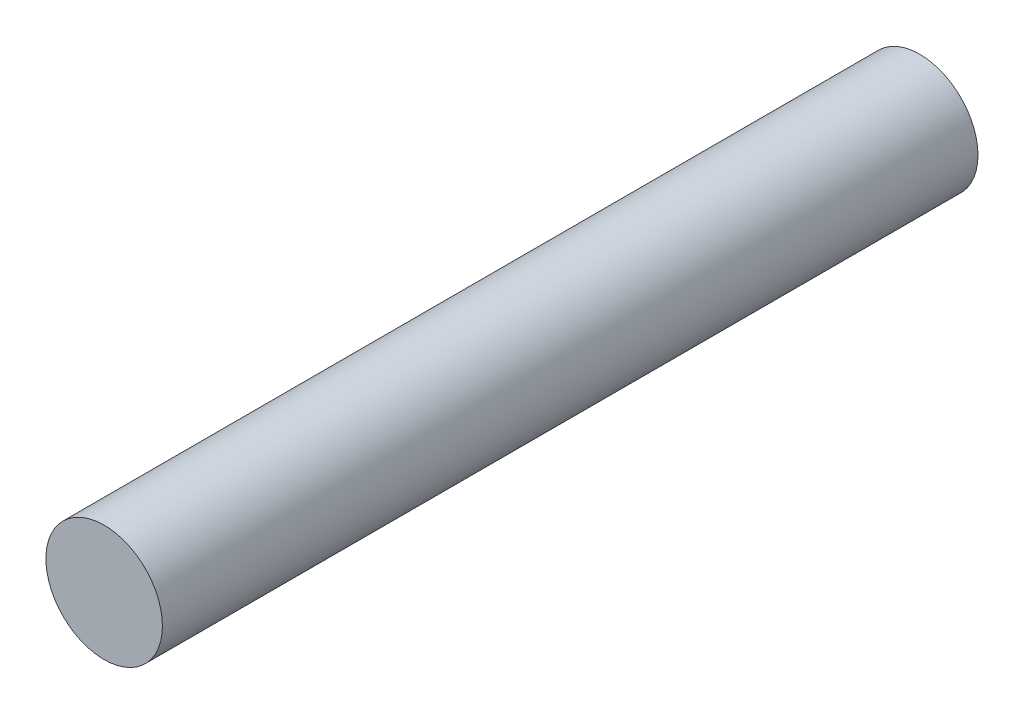
ISO-10303-21;
HEADER;
FILE_DESCRIPTION(('STEP AP214'),'2;1');
FILE_NAME('part.step','',(''),(''),'','','');
FILE_SCHEMA(('AUTOMOTIVE_DESIGN { 1 0 10303 214 1 1 1 1 }'));
ENDSEC;
DATA;
#1=APPLICATION_CONTEXT('core data for automotive mechanical design processes');
#2=APPLICATION_PROTOCOL_DEFINITION('international standard','automotive_design',2000,#1);
#3=PRODUCT_CONTEXT('',#1,'mechanical');
#4=PRODUCT('Part','Part','',(#3));
#5=PRODUCT_RELATED_PRODUCT_CATEGORY('part','',(#4));
#6=PRODUCT_DEFINITION_FORMATION('','',#4);
#7=PRODUCT_DEFINITION_CONTEXT('part definition',#1,'design');
#8=PRODUCT_DEFINITION('design','',#6,#7);
#9=PRODUCT_DEFINITION_SHAPE('','',#8);
#10=(LENGTH_UNIT() NAMED_UNIT(*) SI_UNIT(.MILLI.,.METRE.));
#11=(NAMED_UNIT(*) PLANE_ANGLE_UNIT() SI_UNIT($,.RADIAN.));
#12=(NAMED_UNIT(*) SI_UNIT($,.STERADIAN.) SOLID_ANGLE_UNIT());
#13=UNCERTAINTY_MEASURE_WITH_UNIT(LENGTH_MEASURE(1.E-05),#10,'distance_accuracy_value','');
#14=(GEOMETRIC_REPRESENTATION_CONTEXT(3) GLOBAL_UNCERTAINTY_ASSIGNED_CONTEXT((#13)) GLOBAL_UNIT_ASSIGNED_CONTEXT((#10,
#11,#12)) REPRESENTATION_CONTEXT('',''));
#15=CARTESIAN_POINT('',(0.,0.,0.));
#16=DIRECTION('',(0.,0.,1.));
#17=DIRECTION('',(1.,0.,0.));
#18=AXIS2_PLACEMENT_3D('',#15,#16,#17);
#19=CARTESIAN_POINT('',(0.,0.,35.));
#20=DIRECTION('',(0.,0.,-1.));
#21=DIRECTION('',(-1.,0.,0.));
#22=AXIS2_PLACEMENT_3D('',#19,#20,#21);
#23=CYLINDRICAL_SURFACE('',#22,2.5);
#24=CARTESIAN_POINT('',(0.,0.,35.));
#25=DIRECTION('',(0.,0.,1.));
#26=DIRECTION('',(1.,0.,0.));
#27=AXIS2_PLACEMENT_3D('',#24,#25,#26);
#28=CIRCLE('',#27,2.5);
#29=CARTESIAN_POINT('',(2.5,0.,35.));
#30=VERTEX_POINT('',#29);
#31=EDGE_CURVE('E10',#30,#30,#28,.T.);
#32=ORIENTED_EDGE('',*,*,#31,.F.);
#33=EDGE_LOOP('',(#32));
#34=FACE_BOUND('',#33,.T.);
#35=CARTESIAN_POINT('',(0.,0.,0.));
#36=DIRECTION('',(0.,0.,1.));
#37=DIRECTION('',(1.,0.,0.));
#38=AXIS2_PLACEMENT_3D('',#35,#36,#37);
#39=CIRCLE('',#38,2.5);
#40=CARTESIAN_POINT('',(2.5,0.,0.));
#41=VERTEX_POINT('',#40);
#42=EDGE_CURVE('E40',#41,#41,#39,.T.);
#43=ORIENTED_EDGE('',*,*,#42,.T.);
#44=EDGE_LOOP('',(#43));
#45=FACE_BOUND('',#44,.T.);
#46=ADVANCED_FACE('F37',(#34,#45),#23,.T.);
#47=CARTESIAN_POINT('',(0.,0.,35.));
#48=DIRECTION('',(0.,0.,1.));
#49=DIRECTION('',(1.,0.,0.));
#50=AXIS2_PLACEMENT_3D('',#47,#48,#49);
#51=PLANE('',#50);
#52=ORIENTED_EDGE('',*,*,#31,.T.);
#53=EDGE_LOOP('',(#52));
#54=FACE_BOUND('',#53,.T.);
#55=ADVANCED_FACE('F52',(#54),#51,.T.);
#56=CARTESIAN_POINT('',(0.,0.,0.));
#57=DIRECTION('',(0.,0.,1.));
#58=DIRECTION('',(1.,0.,0.));
#59=AXIS2_PLACEMENT_3D('',#56,#57,#58);
#60=PLANE('',#59);
#61=ORIENTED_EDGE('',*,*,#42,.F.);
#62=EDGE_LOOP('',(#61));
#63=FACE_BOUND('',#62,.T.);
#64=ADVANCED_FACE('F50',(#63),#60,.F.);
#65=CLOSED_SHELL('',(#46,#55,#64));
#66=MANIFOLD_SOLID_BREP('B2',#65);
#67=ADVANCED_BREP_SHAPE_REPRESENTATION('',(#18,#66),#14);
#68=SHAPE_DEFINITION_REPRESENTATION(#9,#67);
ENDSEC;
END-ISO-10303-21;
